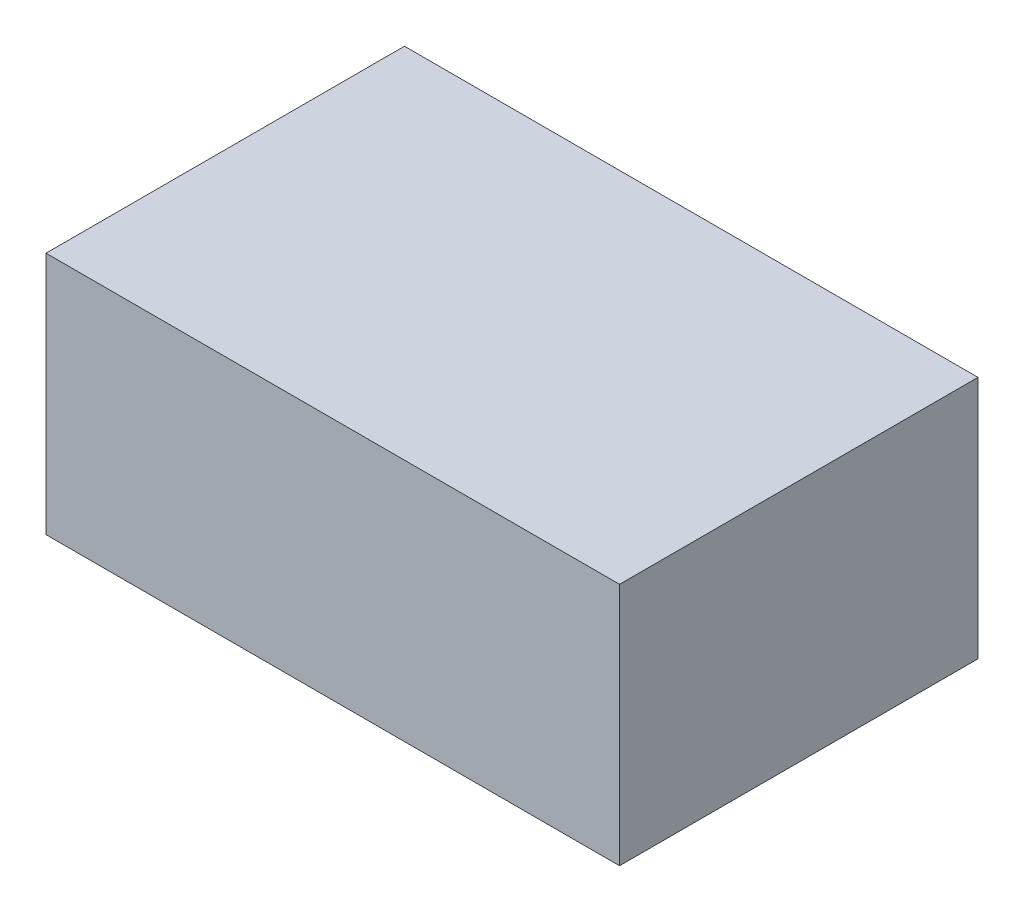
ISO-10303-21;
HEADER;
FILE_DESCRIPTION(('STEP AP214'),'2;1');
FILE_NAME('part.step','',(''),(''),'','','');
FILE_SCHEMA(('AUTOMOTIVE_DESIGN { 1 0 10303 214 1 1 1 1 }'));
ENDSEC;
DATA;
#1=APPLICATION_CONTEXT('core data for automotive mechanical design processes');
#2=APPLICATION_PROTOCOL_DEFINITION('international standard','automotive_design',2000,#1);
#3=PRODUCT_CONTEXT('',#1,'mechanical');
#4=PRODUCT('Part','Part','',(#3));
#5=PRODUCT_RELATED_PRODUCT_CATEGORY('part','',(#4));
#6=PRODUCT_DEFINITION_FORMATION('','',#4);
#7=PRODUCT_DEFINITION_CONTEXT('part definition',#1,'design');
#8=PRODUCT_DEFINITION('design','',#6,#7);
#9=PRODUCT_DEFINITION_SHAPE('','',#8);
#10=(LENGTH_UNIT() NAMED_UNIT(*) SI_UNIT(.MILLI.,.METRE.));
#11=(NAMED_UNIT(*) PLANE_ANGLE_UNIT() SI_UNIT($,.RADIAN.));
#12=(NAMED_UNIT(*) SI_UNIT($,.STERADIAN.) SOLID_ANGLE_UNIT());
#13=UNCERTAINTY_MEASURE_WITH_UNIT(LENGTH_MEASURE(1.E-05),#10,'distance_accuracy_value','');
#14=(GEOMETRIC_REPRESENTATION_CONTEXT(3) GLOBAL_UNCERTAINTY_ASSIGNED_CONTEXT((#13)) GLOBAL_UNIT_ASSIGNED_CONTEXT((#10,
#11,#12)) REPRESENTATION_CONTEXT('',''));
#15=CARTESIAN_POINT('',(0.,0.,0.));
#16=DIRECTION('',(0.,0.,1.));
#17=DIRECTION('',(1.,0.,0.));
#18=AXIS2_PLACEMENT_3D('',#15,#16,#17);
#19=CARTESIAN_POINT('',(0.,0.85,-1.25));
#20=DIRECTION('',(1.,0.,0.));
#21=DIRECTION('',(0.,0.,-1.));
#22=AXIS2_PLACEMENT_3D('',#19,#20,#21);
#23=PLANE('',#22);
#24=DIRECTION('',(0.,0.,1.));
#25=VECTOR('',#24,1.);
#26=CARTESIAN_POINT('',(0.,0.,-1.25));
#27=LINE('',#26,#25);
#28=CARTESIAN_POINT('',(0.,0.,-1.25));
#29=VERTEX_POINT('',#28);
#30=CARTESIAN_POINT('',(0.,0.,0.));
#31=VERTEX_POINT('',#30);
#32=EDGE_CURVE('E97',#29,#31,#27,.T.);
#33=ORIENTED_EDGE('',*,*,#32,.T.);
#34=DIRECTION('',(0.,-1.,0.));
#35=VECTOR('',#34,1.);
#36=CARTESIAN_POINT('',(0.,0.85,0.));
#37=LINE('',#36,#35);
#38=CARTESIAN_POINT('',(0.,0.85,0.));
#39=VERTEX_POINT('',#38);
#40=EDGE_CURVE('E11',#39,#31,#37,.T.);
#41=ORIENTED_EDGE('',*,*,#40,.F.);
#42=DIRECTION('',(0.,0.,1.));
#43=VECTOR('',#42,1.);
#44=CARTESIAN_POINT('',(0.,0.85,-1.25));
#45=LINE('',#44,#43);
#46=CARTESIAN_POINT('',(0.,0.85,-1.25));
#47=VERTEX_POINT('',#46);
#48=EDGE_CURVE('E85',#47,#39,#45,.T.);
#49=ORIENTED_EDGE('',*,*,#48,.F.);
#50=DIRECTION('',(0.,-1.,0.));
#51=VECTOR('',#50,1.);
#52=CARTESIAN_POINT('',(0.,0.85,-1.25));
#53=LINE('',#52,#51);
#54=EDGE_CURVE('E93',#47,#29,#53,.T.);
#55=ORIENTED_EDGE('',*,*,#54,.T.);
#56=EDGE_LOOP('',(#33,#41,#49,#55));
#57=FACE_BOUND('',#56,.T.);
#58=ADVANCED_FACE('F34',(#57),#23,.F.);
#59=CARTESIAN_POINT('',(0.,0.85,0.));
#60=DIRECTION('',(0.,0.,-1.));
#61=DIRECTION('',(-1.,0.,0.));
#62=AXIS2_PLACEMENT_3D('',#59,#60,#61);
#63=PLANE('',#62);
#64=DIRECTION('',(1.,0.,0.));
#65=VECTOR('',#64,1.);
#66=CARTESIAN_POINT('',(0.,0.,0.));
#67=LINE('',#66,#65);
#68=CARTESIAN_POINT('',(2.,0.,0.));
#69=VERTEX_POINT('',#68);
#70=EDGE_CURVE('E89',#31,#69,#67,.T.);
#71=ORIENTED_EDGE('',*,*,#70,.T.);
#72=DIRECTION('',(0.,-1.,0.));
#73=VECTOR('',#72,1.);
#74=CARTESIAN_POINT('',(2.,0.85,0.));
#75=LINE('',#74,#73);
#76=CARTESIAN_POINT('',(2.,0.85,0.));
#77=VERTEX_POINT('',#76);
#78=EDGE_CURVE('E42',#77,#69,#75,.T.);
#79=ORIENTED_EDGE('',*,*,#78,.F.);
#80=DIRECTION('',(1.,0.,0.));
#81=VECTOR('',#80,1.);
#82=CARTESIAN_POINT('',(0.,0.85,0.));
#83=LINE('',#82,#81);
#84=EDGE_CURVE('E80',#39,#77,#83,.T.);
#85=ORIENTED_EDGE('',*,*,#84,.F.);
#86=ORIENTED_EDGE('',*,*,#40,.T.);
#87=EDGE_LOOP('',(#71,#79,#85,#86));
#88=FACE_BOUND('',#87,.T.);
#89=ADVANCED_FACE('F88',(#88),#63,.F.);
#90=CARTESIAN_POINT('',(2.,0.85,0.));
#91=DIRECTION('',(-1.,0.,0.));
#92=DIRECTION('',(0.,0.,1.));
#93=AXIS2_PLACEMENT_3D('',#90,#91,#92);
#94=PLANE('',#93);
#95=DIRECTION('',(0.,0.,-1.));
#96=VECTOR('',#95,1.);
#97=CARTESIAN_POINT('',(2.,0.,0.));
#98=LINE('',#97,#96);
#99=CARTESIAN_POINT('',(2.,0.,-1.25));
#100=VERTEX_POINT('',#99);
#101=EDGE_CURVE('E67',#69,#100,#98,.T.);
#102=ORIENTED_EDGE('',*,*,#101,.T.);
#103=DIRECTION('',(0.,-1.,0.));
#104=VECTOR('',#103,1.);
#105=CARTESIAN_POINT('',(2.,0.85,-1.25));
#106=LINE('',#105,#104);
#107=CARTESIAN_POINT('',(2.,0.85,-1.25));
#108=VERTEX_POINT('',#107);
#109=EDGE_CURVE('E90',#108,#100,#106,.T.);
#110=ORIENTED_EDGE('',*,*,#109,.F.);
#111=DIRECTION('',(0.,0.,-1.));
#112=VECTOR('',#111,1.);
#113=CARTESIAN_POINT('',(2.,0.85,0.));
#114=LINE('',#113,#112);
#115=EDGE_CURVE('E83',#77,#108,#114,.T.);
#116=ORIENTED_EDGE('',*,*,#115,.F.);
#117=ORIENTED_EDGE('',*,*,#78,.T.);
#118=EDGE_LOOP('',(#102,#110,#116,#117));
#119=FACE_BOUND('',#118,.T.);
#120=ADVANCED_FACE('F91',(#119),#94,.F.);
#121=CARTESIAN_POINT('',(2.,0.85,-1.25));
#122=DIRECTION('',(0.,0.,1.));
#123=DIRECTION('',(1.,0.,0.));
#124=AXIS2_PLACEMENT_3D('',#121,#122,#123);
#125=PLANE('',#124);
#126=DIRECTION('',(-1.,0.,0.));
#127=VECTOR('',#126,1.);
#128=CARTESIAN_POINT('',(2.,0.,-1.25));
#129=LINE('',#128,#127);
#130=EDGE_CURVE('E73',#100,#29,#129,.T.);
#131=ORIENTED_EDGE('',*,*,#130,.T.);
#132=ORIENTED_EDGE('',*,*,#54,.F.);
#133=DIRECTION('',(-1.,0.,0.));
#134=VECTOR('',#133,1.);
#135=CARTESIAN_POINT('',(2.,0.85,-1.25));
#136=LINE('',#135,#134);
#137=EDGE_CURVE('E50',#108,#47,#136,.T.);
#138=ORIENTED_EDGE('',*,*,#137,.F.);
#139=ORIENTED_EDGE('',*,*,#109,.T.);
#140=EDGE_LOOP('',(#131,#132,#138,#139));
#141=FACE_BOUND('',#140,.T.);
#142=ADVANCED_FACE('F104',(#141),#125,.F.);
#143=CARTESIAN_POINT('',(0.,0.85,0.));
#144=DIRECTION('',(0.,1.,0.));
#145=DIRECTION('',(0.,0.,1.));
#146=AXIS2_PLACEMENT_3D('',#143,#144,#145);
#147=PLANE('',#146);
#148=ORIENTED_EDGE('',*,*,#48,.T.);
#149=ORIENTED_EDGE('',*,*,#84,.T.);
#150=ORIENTED_EDGE('',*,*,#115,.T.);
#151=ORIENTED_EDGE('',*,*,#137,.T.);
#152=EDGE_LOOP('',(#148,#149,#150,#151));
#153=FACE_BOUND('',#152,.T.);
#154=ADVANCED_FACE('F81',(#153),#147,.T.);
#155=CARTESIAN_POINT('',(0.,0.,0.));
#156=DIRECTION('',(0.,1.,0.));
#157=DIRECTION('',(0.,0.,1.));
#158=AXIS2_PLACEMENT_3D('',#155,#156,#157);
#159=PLANE('',#158);
#160=ORIENTED_EDGE('',*,*,#32,.F.);
#161=ORIENTED_EDGE('',*,*,#130,.F.);
#162=ORIENTED_EDGE('',*,*,#101,.F.);
#163=ORIENTED_EDGE('',*,*,#70,.F.);
#164=EDGE_LOOP('',(#160,#161,#162,#163));
#165=FACE_BOUND('',#164,.T.);
#166=ADVANCED_FACE('F107',(#165),#159,.F.);
#167=CLOSED_SHELL('',(#58,#89,#120,#142,#154,#166));
#168=MANIFOLD_SOLID_BREP('B2',#167);
#169=ADVANCED_BREP_SHAPE_REPRESENTATION('',(#18,#168),#14);
#170=SHAPE_DEFINITION_REPRESENTATION(#9,#169);
ENDSEC;
END-ISO-10303-21;
